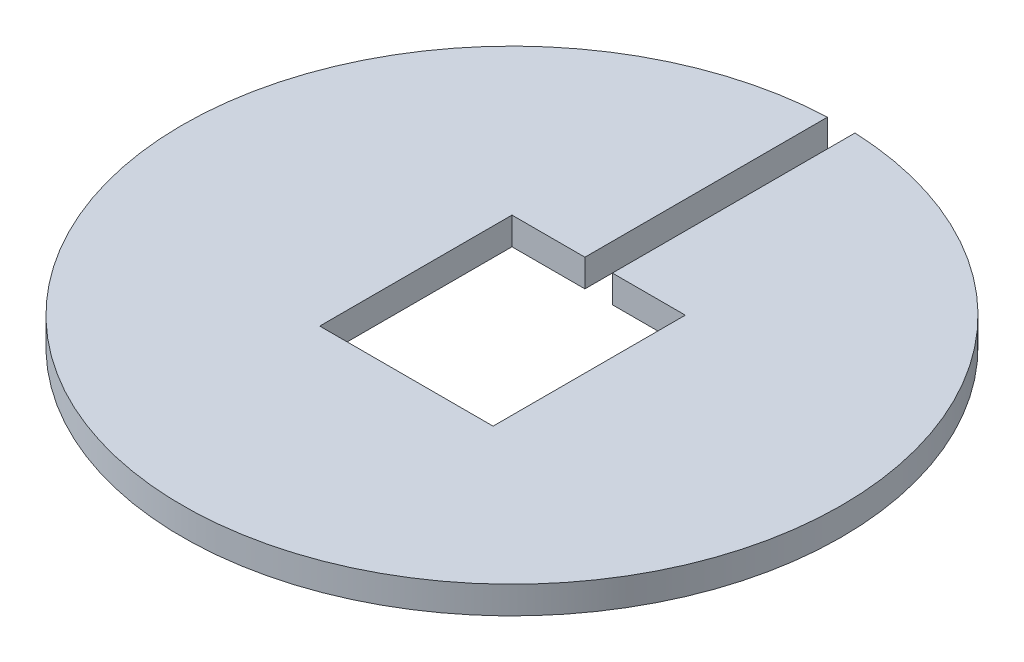
ISO-10303-21;
HEADER;
FILE_DESCRIPTION(('STEP AP214'),'2;1');
FILE_NAME('part.step','',(''),(''),'','','');
FILE_SCHEMA(('AUTOMOTIVE_DESIGN { 1 0 10303 214 1 1 1 1 }'));
ENDSEC;
DATA;
#1=APPLICATION_CONTEXT('core data for automotive mechanical design processes');
#2=APPLICATION_PROTOCOL_DEFINITION('international standard','automotive_design',2000,#1);
#3=PRODUCT_CONTEXT('',#1,'mechanical');
#4=PRODUCT('Part','Part','',(#3));
#5=PRODUCT_RELATED_PRODUCT_CATEGORY('part','',(#4));
#6=PRODUCT_DEFINITION_FORMATION('','',#4);
#7=PRODUCT_DEFINITION_CONTEXT('part definition',#1,'design');
#8=PRODUCT_DEFINITION('design','',#6,#7);
#9=PRODUCT_DEFINITION_SHAPE('','',#8);
#10=(LENGTH_UNIT() NAMED_UNIT(*) SI_UNIT(.MILLI.,.METRE.));
#11=(NAMED_UNIT(*) PLANE_ANGLE_UNIT() SI_UNIT($,.RADIAN.));
#12=(NAMED_UNIT(*) SI_UNIT($,.STERADIAN.) SOLID_ANGLE_UNIT());
#13=UNCERTAINTY_MEASURE_WITH_UNIT(LENGTH_MEASURE(1.E-05),#10,'distance_accuracy_value','');
#14=(GEOMETRIC_REPRESENTATION_CONTEXT(3) GLOBAL_UNCERTAINTY_ASSIGNED_CONTEXT((#13)) GLOBAL_UNIT_ASSIGNED_CONTEXT((#10,
#11,#12)) REPRESENTATION_CONTEXT('',''));
#15=CARTESIAN_POINT('',(0.,0.,0.));
#16=DIRECTION('',(0.,0.,1.));
#17=DIRECTION('',(1.,0.,0.));
#18=AXIS2_PLACEMENT_3D('',#15,#16,#17);
#19=CARTESIAN_POINT('',(-13.3463470781135,3.175,-7.76124551800648));
#20=DIRECTION('',(0.,0.,-1.));
#21=DIRECTION('',(-1.,0.,0.));
#22=AXIS2_PLACEMENT_3D('',#19,#20,#21);
#23=PLANE('',#22);
#24=DIRECTION('',(1.,0.,0.));
#25=VECTOR('',#24,1.);
#26=CARTESIAN_POINT('',(-13.3463470781135,0.,-7.76124551800648));
#27=LINE('',#26,#25);
#28=CARTESIAN_POINT('',(-13.3463470781135,0.,-7.76124551800648));
#29=VERTEX_POINT('',#28);
#30=CARTESIAN_POINT('',(-4.91354707811345,0.,-7.76124551800648));
#31=VERTEX_POINT('',#30);
#32=EDGE_CURVE('E140',#29,#31,#27,.T.);
#33=ORIENTED_EDGE('',*,*,#32,.T.);
#34=DIRECTION('',(0.,-1.,0.));
#35=VECTOR('',#34,1.);
#36=CARTESIAN_POINT('',(-4.91354707811345,3.175,-7.76124551800648));
#37=LINE('',#36,#35);
#38=CARTESIAN_POINT('',(-4.91354707811345,3.175,-7.76124551800648));
#39=VERTEX_POINT('',#38);
#40=EDGE_CURVE('E11',#39,#31,#37,.T.);
#41=ORIENTED_EDGE('',*,*,#40,.F.);
#42=DIRECTION('',(1.,0.,0.));
#43=VECTOR('',#42,1.);
#44=CARTESIAN_POINT('',(-13.3463470781135,3.175,-7.76124551800648));
#45=LINE('',#44,#43);
#46=CARTESIAN_POINT('',(-13.3463470781135,3.175,-7.76124551800648));
#47=VERTEX_POINT('',#46);
#48=EDGE_CURVE('E162',#47,#39,#45,.T.);
#49=ORIENTED_EDGE('',*,*,#48,.F.);
#50=DIRECTION('',(0.,-1.,0.));
#51=VECTOR('',#50,1.);
#52=CARTESIAN_POINT('',(-13.3463470781135,3.175,-7.76124551800648));
#53=LINE('',#52,#51);
#54=EDGE_CURVE('E136',#47,#29,#53,.T.);
#55=ORIENTED_EDGE('',*,*,#54,.T.);
#56=EDGE_LOOP('',(#33,#41,#49,#55));
#57=FACE_BOUND('',#56,.T.);
#58=ADVANCED_FACE('F39',(#57),#23,.F.);
#59=CARTESIAN_POINT('',(-4.91354707811345,3.175,-7.76124551800648));
#60=DIRECTION('',(-1.,0.,0.));
#61=DIRECTION('',(0.,0.,1.));
#62=AXIS2_PLACEMENT_3D('',#59,#60,#61);
#63=PLANE('',#62);
#64=DIRECTION('',(0.,0.,-1.));
#65=VECTOR('',#64,1.);
#66=CARTESIAN_POINT('',(-4.91354707811345,0.,-7.76124551800648));
#67=LINE('',#66,#65);
#68=CARTESIAN_POINT('',(-4.91354707811345,0.,-35.8078582343012));
#69=VERTEX_POINT('',#68);
#70=EDGE_CURVE('E144',#31,#69,#67,.T.);
#71=ORIENTED_EDGE('',*,*,#70,.T.);
#72=DIRECTION('',(0.,-1.,0.));
#73=VECTOR('',#72,1.);
#74=CARTESIAN_POINT('',(-4.91354707811345,3.175,-35.8078582343012));
#75=LINE('',#74,#73);
#76=CARTESIAN_POINT('',(-4.91354707811345,3.175,-35.8078582343012));
#77=VERTEX_POINT('',#76);
#78=EDGE_CURVE('E48',#77,#69,#75,.T.);
#79=ORIENTED_EDGE('',*,*,#78,.F.);
#80=DIRECTION('',(0.,0.,-1.));
#81=VECTOR('',#80,1.);
#82=CARTESIAN_POINT('',(-4.91354707811345,3.175,-7.76124551800648));
#83=LINE('',#82,#81);
#84=EDGE_CURVE('E99',#39,#77,#83,.T.);
#85=ORIENTED_EDGE('',*,*,#84,.F.);
#86=ORIENTED_EDGE('',*,*,#40,.T.);
#87=EDGE_LOOP('',(#71,#79,#85,#86));
#88=FACE_BOUND('',#87,.T.);
#89=ADVANCED_FACE('F208',(#88),#63,.F.);
#90=CARTESIAN_POINT('',(-3.32604707811345,3.175,2.25905448199352));
#91=DIRECTION('',(0.,-1.,0.));
#92=DIRECTION('',(0.,0.,-1.));
#93=AXIS2_PLACEMENT_3D('',#90,#91,#92);
#94=CYLINDRICAL_SURFACE('',#93,38.1);
#95=CARTESIAN_POINT('',(-3.32604707811345,0.,2.25905448199352));
#96=DIRECTION('',(0.,1.,0.));
#97=DIRECTION('',(0.,0.,1.));
#98=AXIS2_PLACEMENT_3D('',#95,#96,#97);
#99=CIRCLE('',#98,38.1);
#100=CARTESIAN_POINT('',(-1.73854707811342,0.,-35.8078582343012));
#101=VERTEX_POINT('',#100);
#102=EDGE_CURVE('E147',#69,#101,#99,.T.);
#103=ORIENTED_EDGE('',*,*,#102,.T.);
#104=DIRECTION('',(0.,-1.,0.));
#105=VECTOR('',#104,1.);
#106=CARTESIAN_POINT('',(-1.73854707811342,3.175,-35.8078582343012));
#107=LINE('',#106,#105);
#108=CARTESIAN_POINT('',(-1.73854707811342,3.175,-35.8078582343012));
#109=VERTEX_POINT('',#108);
#110=EDGE_CURVE('E173',#109,#101,#107,.T.);
#111=ORIENTED_EDGE('',*,*,#110,.F.);
#112=CARTESIAN_POINT('',(-3.32604707811345,3.175,2.25905448199352));
#113=DIRECTION('',(0.,1.,0.));
#114=DIRECTION('',(0.,0.,1.));
#115=AXIS2_PLACEMENT_3D('',#112,#113,#114);
#116=CIRCLE('',#115,38.1);
#117=EDGE_CURVE('E183',#77,#109,#116,.T.);
#118=ORIENTED_EDGE('',*,*,#117,.F.);
#119=ORIENTED_EDGE('',*,*,#78,.T.);
#120=EDGE_LOOP('',(#103,#111,#118,#119));
#121=FACE_BOUND('',#120,.T.);
#122=ADVANCED_FACE('F181',(#121),#94,.T.);
#123=CARTESIAN_POINT('',(-1.73854707811345,3.175,-7.76124551800648));
#124=DIRECTION('',(1.,0.,0.));
#125=DIRECTION('',(0.,0.,-1.));
#126=AXIS2_PLACEMENT_3D('',#123,#124,#125);
#127=PLANE('',#126);
#128=DIRECTION('',(0.,0.,1.));
#129=VECTOR('',#128,1.);
#130=CARTESIAN_POINT('',(-1.73854707811345,0.,-7.76124551800648));
#131=LINE('',#130,#129);
#132=CARTESIAN_POINT('',(-1.73854707811345,0.,-7.76124551800648));
#133=VERTEX_POINT('',#132);
#134=EDGE_CURVE('E150',#101,#133,#131,.T.);
#135=ORIENTED_EDGE('',*,*,#134,.T.);
#136=DIRECTION('',(0.,-1.,0.));
#137=VECTOR('',#136,1.);
#138=CARTESIAN_POINT('',(-1.73854707811345,3.175,-7.76124551800648));
#139=LINE('',#138,#137);
#140=CARTESIAN_POINT('',(-1.73854707811345,3.175,-7.76124551800648));
#141=VERTEX_POINT('',#140);
#142=EDGE_CURVE('E169',#141,#133,#139,.T.);
#143=ORIENTED_EDGE('',*,*,#142,.F.);
#144=DIRECTION('',(0.,0.,1.));
#145=VECTOR('',#144,1.);
#146=CARTESIAN_POINT('',(-1.73854707811345,3.175,-7.76124551800648));
#147=LINE('',#146,#145);
#148=EDGE_CURVE('E196',#109,#141,#147,.T.);
#149=ORIENTED_EDGE('',*,*,#148,.F.);
#150=ORIENTED_EDGE('',*,*,#110,.T.);
#151=EDGE_LOOP('',(#135,#143,#149,#150));
#152=FACE_BOUND('',#151,.T.);
#153=ADVANCED_FACE('F191',(#152),#127,.F.);
#154=CARTESIAN_POINT('',(-1.73854707811345,3.175,-7.76124551800648));
#155=DIRECTION('',(0.,0.,-1.));
#156=DIRECTION('',(-1.,0.,0.));
#157=AXIS2_PLACEMENT_3D('',#154,#155,#156);
#158=PLANE('',#157);
#159=DIRECTION('',(1.,0.,0.));
#160=VECTOR('',#159,1.);
#161=CARTESIAN_POINT('',(-1.73854707811345,0.,-7.76124551800648));
#162=LINE('',#161,#160);
#163=CARTESIAN_POINT('',(6.69425292188654,0.,-7.76124551800648));
#164=VERTEX_POINT('',#163);
#165=EDGE_CURVE('E153',#133,#164,#162,.T.);
#166=ORIENTED_EDGE('',*,*,#165,.T.);
#167=DIRECTION('',(0.,-1.,0.));
#168=VECTOR('',#167,1.);
#169=CARTESIAN_POINT('',(6.69425292188654,3.175,-7.76124551800648));
#170=LINE('',#169,#168);
#171=CARTESIAN_POINT('',(6.69425292188654,3.175,-7.76124551800648));
#172=VERTEX_POINT('',#171);
#173=EDGE_CURVE('E129',#172,#164,#170,.T.);
#174=ORIENTED_EDGE('',*,*,#173,.F.);
#175=DIRECTION('',(1.,0.,0.));
#176=VECTOR('',#175,1.);
#177=CARTESIAN_POINT('',(-1.73854707811345,3.175,-7.76124551800648));
#178=LINE('',#177,#176);
#179=EDGE_CURVE('E118',#141,#172,#178,.T.);
#180=ORIENTED_EDGE('',*,*,#179,.F.);
#181=ORIENTED_EDGE('',*,*,#142,.T.);
#182=EDGE_LOOP('',(#166,#174,#180,#181));
#183=FACE_BOUND('',#182,.T.);
#184=ADVANCED_FACE('F194',(#183),#158,.F.);
#185=CARTESIAN_POINT('',(6.69425292188654,3.175,-7.76124551800648));
#186=DIRECTION('',(1.,0.,0.));
#187=DIRECTION('',(0.,0.,-1.));
#188=AXIS2_PLACEMENT_3D('',#185,#186,#187);
#189=PLANE('',#188);
#190=DIRECTION('',(0.,0.,1.));
#191=VECTOR('',#190,1.);
#192=CARTESIAN_POINT('',(6.69425292188654,0.,-7.76124551800648));
#193=LINE('',#192,#191);
#194=CARTESIAN_POINT('',(6.69425292188655,0.,14.4637544819935));
#195=VERTEX_POINT('',#194);
#196=EDGE_CURVE('E127',#164,#195,#193,.T.);
#197=ORIENTED_EDGE('',*,*,#196,.T.);
#198=DIRECTION('',(0.,-1.,0.));
#199=VECTOR('',#198,1.);
#200=CARTESIAN_POINT('',(6.69425292188655,3.175,14.4637544819935));
#201=LINE('',#200,#199);
#202=CARTESIAN_POINT('',(6.69425292188655,3.175,14.4637544819935));
#203=VERTEX_POINT('',#202);
#204=EDGE_CURVE('E124',#203,#195,#201,.T.);
#205=ORIENTED_EDGE('',*,*,#204,.F.);
#206=DIRECTION('',(0.,0.,1.));
#207=VECTOR('',#206,1.);
#208=CARTESIAN_POINT('',(6.69425292188654,3.175,-7.76124551800648));
#209=LINE('',#208,#207);
#210=EDGE_CURVE('E112',#172,#203,#209,.T.);
#211=ORIENTED_EDGE('',*,*,#210,.F.);
#212=ORIENTED_EDGE('',*,*,#173,.T.);
#213=EDGE_LOOP('',(#197,#205,#211,#212));
#214=FACE_BOUND('',#213,.T.);
#215=ADVANCED_FACE('F125',(#214),#189,.F.);
#216=CARTESIAN_POINT('',(-13.3463470781134,3.175,14.4637544819935));
#217=DIRECTION('',(0.,0.,1.));
#218=DIRECTION('',(1.,0.,0.));
#219=AXIS2_PLACEMENT_3D('',#216,#217,#218);
#220=PLANE('',#219);
#221=DIRECTION('',(-1.,0.,0.));
#222=VECTOR('',#221,1.);
#223=CARTESIAN_POINT('',(-13.3463470781134,0.,14.4637544819935));
#224=LINE('',#223,#222);
#225=CARTESIAN_POINT('',(-13.3463470781134,0.,14.4637544819935));
#226=VERTEX_POINT('',#225);
#227=EDGE_CURVE('E85',#195,#226,#224,.T.);
#228=ORIENTED_EDGE('',*,*,#227,.T.);
#229=DIRECTION('',(0.,-1.,0.));
#230=VECTOR('',#229,1.);
#231=CARTESIAN_POINT('',(-13.3463470781134,3.175,14.4637544819935));
#232=LINE('',#231,#230);
#233=CARTESIAN_POINT('',(-13.3463470781134,3.175,14.4637544819935));
#234=VERTEX_POINT('',#233);
#235=EDGE_CURVE('E130',#234,#226,#232,.T.);
#236=ORIENTED_EDGE('',*,*,#235,.F.);
#237=DIRECTION('',(-1.,0.,0.));
#238=VECTOR('',#237,1.);
#239=CARTESIAN_POINT('',(-13.3463470781134,3.175,14.4637544819935));
#240=LINE('',#239,#238);
#241=EDGE_CURVE('E116',#203,#234,#240,.T.);
#242=ORIENTED_EDGE('',*,*,#241,.F.);
#243=ORIENTED_EDGE('',*,*,#204,.T.);
#244=EDGE_LOOP('',(#228,#236,#242,#243));
#245=FACE_BOUND('',#244,.T.);
#246=ADVANCED_FACE('F132',(#245),#220,.F.);
#247=CARTESIAN_POINT('',(-13.3463470781135,3.175,-7.76124551800648));
#248=DIRECTION('',(-1.,0.,0.));
#249=DIRECTION('',(0.,0.,1.));
#250=AXIS2_PLACEMENT_3D('',#247,#248,#249);
#251=PLANE('',#250);
#252=DIRECTION('',(0.,0.,-1.));
#253=VECTOR('',#252,1.);
#254=CARTESIAN_POINT('',(-13.3463470781135,0.,-7.76124551800648));
#255=LINE('',#254,#253);
#256=EDGE_CURVE('E91',#226,#29,#255,.T.);
#257=ORIENTED_EDGE('',*,*,#256,.T.);
#258=ORIENTED_EDGE('',*,*,#54,.F.);
#259=DIRECTION('',(0.,0.,-1.));
#260=VECTOR('',#259,1.);
#261=CARTESIAN_POINT('',(-13.3463470781135,3.175,-7.76124551800648));
#262=LINE('',#261,#260);
#263=EDGE_CURVE('E56',#234,#47,#262,.T.);
#264=ORIENTED_EDGE('',*,*,#263,.F.);
#265=ORIENTED_EDGE('',*,*,#235,.T.);
#266=EDGE_LOOP('',(#257,#258,#264,#265));
#267=FACE_BOUND('',#266,.T.);
#268=ADVANCED_FACE('F224',(#267),#251,.F.);
#269=CARTESIAN_POINT('',(-3.32604707811345,3.175,2.25905448199352));
#270=DIRECTION('',(0.,1.,0.));
#271=DIRECTION('',(0.,0.,1.));
#272=AXIS2_PLACEMENT_3D('',#269,#270,#271);
#273=PLANE('',#272);
#274=ORIENTED_EDGE('',*,*,#48,.T.);
#275=ORIENTED_EDGE('',*,*,#84,.T.);
#276=ORIENTED_EDGE('',*,*,#117,.T.);
#277=ORIENTED_EDGE('',*,*,#148,.T.);
#278=ORIENTED_EDGE('',*,*,#179,.T.);
#279=ORIENTED_EDGE('',*,*,#210,.T.);
#280=ORIENTED_EDGE('',*,*,#241,.T.);
#281=ORIENTED_EDGE('',*,*,#263,.T.);
#282=EDGE_LOOP('',(#274,#275,#276,#277,#278,#279,#280,#281));
#283=FACE_BOUND('',#282,.T.);
#284=ADVANCED_FACE('F114',(#283),#273,.T.);
#285=CARTESIAN_POINT('',(-3.32604707811345,0.,2.25905448199352));
#286=DIRECTION('',(0.,1.,0.));
#287=DIRECTION('',(0.,0.,1.));
#288=AXIS2_PLACEMENT_3D('',#285,#286,#287);
#289=PLANE('',#288);
#290=ORIENTED_EDGE('',*,*,#32,.F.);
#291=ORIENTED_EDGE('',*,*,#256,.F.);
#292=ORIENTED_EDGE('',*,*,#227,.F.);
#293=ORIENTED_EDGE('',*,*,#196,.F.);
#294=ORIENTED_EDGE('',*,*,#165,.F.);
#295=ORIENTED_EDGE('',*,*,#134,.F.);
#296=ORIENTED_EDGE('',*,*,#102,.F.);
#297=ORIENTED_EDGE('',*,*,#70,.F.);
#298=EDGE_LOOP('',(#290,#291,#292,#293,#294,#295,#296,#297));
#299=FACE_BOUND('',#298,.T.);
#300=ADVANCED_FACE('F187',(#299),#289,.F.);
#301=CLOSED_SHELL('',(#58,#89,#122,#153,#184,#215,#246,#268,#284,#300));
#302=MANIFOLD_SOLID_BREP('B2',#301);
#303=ADVANCED_BREP_SHAPE_REPRESENTATION('',(#18,#302),#14);
#304=SHAPE_DEFINITION_REPRESENTATION(#9,#303);
ENDSEC;
END-ISO-10303-21;
